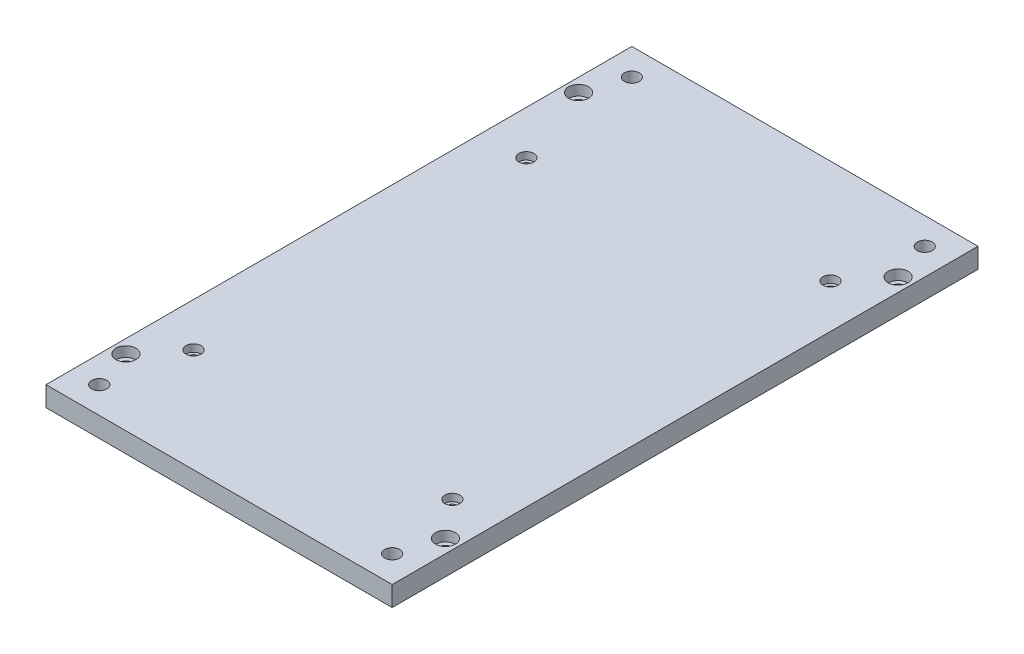
ISO-10303-21;
HEADER;
FILE_DESCRIPTION(('STEP AP214'),'2;1');
FILE_NAME('part.step','',(''),(''),'','','');
FILE_SCHEMA(('AUTOMOTIVE_DESIGN { 1 0 10303 214 1 1 1 1 }'));
ENDSEC;
DATA;
#1=APPLICATION_CONTEXT('core data for automotive mechanical design processes');
#2=APPLICATION_PROTOCOL_DEFINITION('international standard','automotive_design',2000,#1);
#3=PRODUCT_CONTEXT('',#1,'mechanical');
#4=PRODUCT('Part','Part','',(#3));
#5=PRODUCT_RELATED_PRODUCT_CATEGORY('part','',(#4));
#6=PRODUCT_DEFINITION_FORMATION('','',#4);
#7=PRODUCT_DEFINITION_CONTEXT('part definition',#1,'design');
#8=PRODUCT_DEFINITION('design','',#6,#7);
#9=PRODUCT_DEFINITION_SHAPE('','',#8);
#10=(LENGTH_UNIT() NAMED_UNIT(*) SI_UNIT(.MILLI.,.METRE.));
#11=(NAMED_UNIT(*) PLANE_ANGLE_UNIT() SI_UNIT($,.RADIAN.));
#12=(NAMED_UNIT(*) SI_UNIT($,.STERADIAN.) SOLID_ANGLE_UNIT());
#13=UNCERTAINTY_MEASURE_WITH_UNIT(LENGTH_MEASURE(1.E-05),#10,'distance_accuracy_value','');
#14=(GEOMETRIC_REPRESENTATION_CONTEXT(3) GLOBAL_UNCERTAINTY_ASSIGNED_CONTEXT((#13)) GLOBAL_UNIT_ASSIGNED_CONTEXT((#10,
#11,#12)) REPRESENTATION_CONTEXT('',''));
#15=CARTESIAN_POINT('',(0.,0.,0.));
#16=DIRECTION('',(0.,0.,1.));
#17=DIRECTION('',(1.,0.,0.));
#18=AXIS2_PLACEMENT_3D('',#15,#16,#17);
#19=CARTESIAN_POINT('',(0.,9.525,0.));
#20=DIRECTION('',(0.,0.,-1.));
#21=DIRECTION('',(-1.,0.,0.));
#22=AXIS2_PLACEMENT_3D('',#19,#20,#21);
#23=PLANE('',#22);
#24=DIRECTION('',(1.,0.,0.));
#25=VECTOR('',#24,1.);
#26=CARTESIAN_POINT('',(0.,0.,0.));
#27=LINE('',#26,#25);
#28=CARTESIAN_POINT('',(0.,0.,0.));
#29=VERTEX_POINT('',#28);
#30=CARTESIAN_POINT('',(165.1,0.,0.));
#31=VERTEX_POINT('',#30);
#32=EDGE_CURVE('E149',#29,#31,#27,.T.);
#33=ORIENTED_EDGE('',*,*,#32,.T.);
#34=DIRECTION('',(0.,-1.,0.));
#35=VECTOR('',#34,1.);
#36=CARTESIAN_POINT('',(165.1,9.525,0.));
#37=LINE('',#36,#35);
#38=CARTESIAN_POINT('',(165.1,9.525,0.));
#39=VERTEX_POINT('',#38);
#40=EDGE_CURVE('E12',#39,#31,#37,.T.);
#41=ORIENTED_EDGE('',*,*,#40,.F.);
#42=DIRECTION('',(1.,0.,0.));
#43=VECTOR('',#42,1.);
#44=CARTESIAN_POINT('',(0.,9.525,0.));
#45=LINE('',#44,#43);
#46=CARTESIAN_POINT('',(0.,9.525,0.));
#47=VERTEX_POINT('',#46);
#48=EDGE_CURVE('E131',#47,#39,#45,.T.);
#49=ORIENTED_EDGE('',*,*,#48,.F.);
#50=DIRECTION('',(0.,-1.,0.));
#51=VECTOR('',#50,1.);
#52=CARTESIAN_POINT('',(0.,9.525,0.));
#53=LINE('',#52,#51);
#54=EDGE_CURVE('E93',#47,#29,#53,.T.);
#55=ORIENTED_EDGE('',*,*,#54,.T.);
#56=EDGE_LOOP('',(#33,#41,#49,#55));
#57=FACE_BOUND('',#56,.T.);
#58=ADVANCED_FACE('F73',(#57),#23,.F.);
#59=CARTESIAN_POINT('',(165.1,9.525,0.));
#60=DIRECTION('',(-1.,0.,0.));
#61=DIRECTION('',(0.,0.,1.));
#62=AXIS2_PLACEMENT_3D('',#59,#60,#61);
#63=PLANE('',#62);
#64=DIRECTION('',(0.,0.,-1.));
#65=VECTOR('',#64,1.);
#66=CARTESIAN_POINT('',(165.1,0.,0.));
#67=LINE('',#66,#65);
#68=CARTESIAN_POINT('',(165.1,0.,-279.4));
#69=VERTEX_POINT('',#68);
#70=EDGE_CURVE('E137',#31,#69,#67,.T.);
#71=ORIENTED_EDGE('',*,*,#70,.T.);
#72=DIRECTION('',(0.,-1.,0.));
#73=VECTOR('',#72,1.);
#74=CARTESIAN_POINT('',(165.1,9.525,-279.4));
#75=LINE('',#74,#73);
#76=CARTESIAN_POINT('',(165.1,9.525,-279.4));
#77=VERTEX_POINT('',#76);
#78=EDGE_CURVE('E82',#77,#69,#75,.T.);
#79=ORIENTED_EDGE('',*,*,#78,.F.);
#80=DIRECTION('',(0.,0.,-1.));
#81=VECTOR('',#80,1.);
#82=CARTESIAN_POINT('',(165.1,9.525,0.));
#83=LINE('',#82,#81);
#84=EDGE_CURVE('E123',#39,#77,#83,.T.);
#85=ORIENTED_EDGE('',*,*,#84,.F.);
#86=ORIENTED_EDGE('',*,*,#40,.T.);
#87=EDGE_LOOP('',(#71,#79,#85,#86));
#88=FACE_BOUND('',#87,.T.);
#89=ADVANCED_FACE('F136',(#88),#63,.F.);
#90=CARTESIAN_POINT('',(0.,9.525,-279.4));
#91=DIRECTION('',(0.,0.,-1.));
#92=DIRECTION('',(-1.,0.,0.));
#93=AXIS2_PLACEMENT_3D('',#90,#91,#92);
#94=PLANE('',#93);
#95=DIRECTION('',(1.,0.,0.));
#96=VECTOR('',#95,1.);
#97=CARTESIAN_POINT('',(0.,0.,-279.4));
#98=LINE('',#97,#96);
#99=CARTESIAN_POINT('',(0.,0.,-279.4));
#100=VERTEX_POINT('',#99);
#101=EDGE_CURVE('E155',#100,#69,#98,.T.);
#102=ORIENTED_EDGE('',*,*,#101,.F.);
#103=DIRECTION('',(0.,-1.,0.));
#104=VECTOR('',#103,1.);
#105=CARTESIAN_POINT('',(0.,9.525,-279.4));
#106=LINE('',#105,#104);
#107=CARTESIAN_POINT('',(0.,9.525,-279.4));
#108=VERTEX_POINT('',#107);
#109=EDGE_CURVE('E109',#108,#100,#106,.T.);
#110=ORIENTED_EDGE('',*,*,#109,.F.);
#111=DIRECTION('',(1.,0.,0.));
#112=VECTOR('',#111,1.);
#113=CARTESIAN_POINT('',(0.,9.525,-279.4));
#114=LINE('',#113,#112);
#115=EDGE_CURVE('E130',#108,#77,#114,.T.);
#116=ORIENTED_EDGE('',*,*,#115,.T.);
#117=ORIENTED_EDGE('',*,*,#78,.T.);
#118=EDGE_LOOP('',(#102,#110,#116,#117));
#119=FACE_BOUND('',#118,.T.);
#120=ADVANCED_FACE('F141',(#119),#94,.T.);
#121=CARTESIAN_POINT('',(0.,9.525,0.));
#122=DIRECTION('',(-1.,0.,0.));
#123=DIRECTION('',(0.,0.,1.));
#124=AXIS2_PLACEMENT_3D('',#121,#122,#123);
#125=PLANE('',#124);
#126=DIRECTION('',(0.,0.,-1.));
#127=VECTOR('',#126,1.);
#128=CARTESIAN_POINT('',(0.,0.,0.));
#129=LINE('',#128,#127);
#130=EDGE_CURVE('E158',#29,#100,#129,.T.);
#131=ORIENTED_EDGE('',*,*,#130,.F.);
#132=ORIENTED_EDGE('',*,*,#54,.F.);
#133=DIRECTION('',(0.,0.,-1.));
#134=VECTOR('',#133,1.);
#135=CARTESIAN_POINT('',(0.,9.525,0.));
#136=LINE('',#135,#134);
#137=EDGE_CURVE('E143',#47,#108,#136,.T.);
#138=ORIENTED_EDGE('',*,*,#137,.T.);
#139=ORIENTED_EDGE('',*,*,#109,.T.);
#140=EDGE_LOOP('',(#131,#132,#138,#139));
#141=FACE_BOUND('',#140,.T.);
#142=ADVANCED_FACE('F333',(#141),#125,.T.);
#143=CARTESIAN_POINT('',(0.,9.525,0.));
#144=DIRECTION('',(0.,1.,0.));
#145=DIRECTION('',(0.,0.,1.));
#146=AXIS2_PLACEMENT_3D('',#143,#144,#145);
#147=PLANE('',#146);
#148=CARTESIAN_POINT('',(144.272,9.525,-229.87));
#149=DIRECTION('',(0.,1.,0.));
#150=DIRECTION('',(0.,0.,1.));
#151=AXIS2_PLACEMENT_3D('',#148,#149,#150);
#152=CIRCLE('',#151,3.57251);
#153=CARTESIAN_POINT('',(144.272,9.525,-226.29749));
#154=VERTEX_POINT('',#153);
#155=EDGE_CURVE('E323',#154,#154,#152,.T.);
#156=ORIENTED_EDGE('',*,*,#155,.F.);
#157=EDGE_LOOP('',(#156));
#158=FACE_BOUND('',#157,.T.);
#159=CARTESIAN_POINT('',(144.272,9.525,-49.53));
#160=DIRECTION('',(0.,1.,0.));
#161=DIRECTION('',(0.,0.,1.));
#162=AXIS2_PLACEMENT_3D('',#159,#160,#161);
#163=CIRCLE('',#162,3.57251);
#164=CARTESIAN_POINT('',(144.272,9.525,-45.95749));
#165=VERTEX_POINT('',#164);
#166=EDGE_CURVE('E307',#165,#165,#163,.T.);
#167=ORIENTED_EDGE('',*,*,#166,.F.);
#168=EDGE_LOOP('',(#167));
#169=FACE_BOUND('',#168,.T.);
#170=CARTESIAN_POINT('',(20.828,9.525,-49.53));
#171=DIRECTION('',(0.,1.,0.));
#172=DIRECTION('',(0.,0.,1.));
#173=AXIS2_PLACEMENT_3D('',#170,#171,#172);
#174=CIRCLE('',#173,3.57251);
#175=CARTESIAN_POINT('',(20.828,9.525,-45.95749));
#176=VERTEX_POINT('',#175);
#177=EDGE_CURVE('E291',#176,#176,#174,.T.);
#178=ORIENTED_EDGE('',*,*,#177,.F.);
#179=EDGE_LOOP('',(#178));
#180=FACE_BOUND('',#179,.T.);
#181=CARTESIAN_POINT('',(20.828,9.525,-208.28));
#182=DIRECTION('',(0.,1.,0.));
#183=DIRECTION('',(0.,0.,1.));
#184=AXIS2_PLACEMENT_3D('',#181,#182,#183);
#185=CIRCLE('',#184,3.57251);
#186=CARTESIAN_POINT('',(20.828,9.525,-204.70749));
#187=VERTEX_POINT('',#186);
#188=EDGE_CURVE('E275',#187,#187,#185,.T.);
#189=ORIENTED_EDGE('',*,*,#188,.F.);
#190=EDGE_LOOP('',(#189));
#191=FACE_BOUND('',#190,.T.);
#192=CARTESIAN_POINT('',(6.34999999999999,9.525,-31.75));
#193=DIRECTION('',(0.,1.,0.));
#194=DIRECTION('',(0.,0.,1.));
#195=AXIS2_PLACEMENT_3D('',#192,#193,#194);
#196=CIRCLE('',#195,4.7625);
#197=CARTESIAN_POINT('',(6.34999999999999,9.525,-26.9875));
#198=VERTEX_POINT('',#197);
#199=EDGE_CURVE('E259',#198,#198,#196,.T.);
#200=ORIENTED_EDGE('',*,*,#199,.F.);
#201=EDGE_LOOP('',(#200));
#202=FACE_BOUND('',#201,.T.);
#203=CARTESIAN_POINT('',(158.75,9.525,-31.75));
#204=DIRECTION('',(0.,1.,0.));
#205=DIRECTION('',(0.,0.,1.));
#206=AXIS2_PLACEMENT_3D('',#203,#204,#205);
#207=CIRCLE('',#206,4.7625);
#208=CARTESIAN_POINT('',(158.75,9.525,-26.9875));
#209=VERTEX_POINT('',#208);
#210=EDGE_CURVE('E243',#209,#209,#207,.T.);
#211=ORIENTED_EDGE('',*,*,#210,.F.);
#212=EDGE_LOOP('',(#211));
#213=FACE_BOUND('',#212,.T.);
#214=CARTESIAN_POINT('',(158.75,9.525,-247.65));
#215=DIRECTION('',(0.,1.,0.));
#216=DIRECTION('',(0.,0.,1.));
#217=AXIS2_PLACEMENT_3D('',#214,#215,#216);
#218=CIRCLE('',#217,4.7625);
#219=CARTESIAN_POINT('',(158.75,9.525,-242.8875));
#220=VERTEX_POINT('',#219);
#221=EDGE_CURVE('E227',#220,#220,#218,.T.);
#222=ORIENTED_EDGE('',*,*,#221,.F.);
#223=EDGE_LOOP('',(#222));
#224=FACE_BOUND('',#223,.T.);
#225=CARTESIAN_POINT('',(6.34999999999999,9.525,-247.65));
#226=DIRECTION('',(0.,1.,0.));
#227=DIRECTION('',(0.,0.,1.));
#228=AXIS2_PLACEMENT_3D('',#225,#226,#227);
#229=CIRCLE('',#228,4.7625);
#230=CARTESIAN_POINT('',(6.34999999999999,9.525,-242.8875));
#231=VERTEX_POINT('',#230);
#232=EDGE_CURVE('E211',#231,#231,#229,.T.);
#233=ORIENTED_EDGE('',*,*,#232,.F.);
#234=EDGE_LOOP('',(#233));
#235=FACE_BOUND('',#234,.T.);
#236=CARTESIAN_POINT('',(152.4,9.525,-12.7));
#237=DIRECTION('',(0.,1.,0.));
#238=DIRECTION('',(0.,0.,1.));
#239=AXIS2_PLACEMENT_3D('',#236,#237,#238);
#240=CIRCLE('',#239,3.57123999999995);
#241=CARTESIAN_POINT('',(152.4,9.525,-9.12876000000004));
#242=VERTEX_POINT('',#241);
#243=EDGE_CURVE('E195',#242,#242,#240,.T.);
#244=ORIENTED_EDGE('',*,*,#243,.F.);
#245=EDGE_LOOP('',(#244));
#246=FACE_BOUND('',#245,.T.);
#247=CARTESIAN_POINT('',(12.7,9.525,-12.7));
#248=DIRECTION('',(0.,1.,0.));
#249=DIRECTION('',(0.,0.,1.));
#250=AXIS2_PLACEMENT_3D('',#247,#248,#249);
#251=CIRCLE('',#250,3.57123999999996);
#252=CARTESIAN_POINT('',(12.7,9.525,-9.12876000000003));
#253=VERTEX_POINT('',#252);
#254=EDGE_CURVE('E187',#253,#253,#251,.T.);
#255=ORIENTED_EDGE('',*,*,#254,.F.);
#256=EDGE_LOOP('',(#255));
#257=FACE_BOUND('',#256,.T.);
#258=CARTESIAN_POINT('',(12.7,9.525,-266.7));
#259=DIRECTION('',(0.,1.,0.));
#260=DIRECTION('',(0.,0.,1.));
#261=AXIS2_PLACEMENT_3D('',#258,#259,#260);
#262=CIRCLE('',#261,3.57123999999996);
#263=CARTESIAN_POINT('',(12.7,9.525,-263.12876));
#264=VERTEX_POINT('',#263);
#265=EDGE_CURVE('E179',#264,#264,#262,.T.);
#266=ORIENTED_EDGE('',*,*,#265,.F.);
#267=EDGE_LOOP('',(#266));
#268=FACE_BOUND('',#267,.T.);
#269=CARTESIAN_POINT('',(152.4,9.525,-266.7));
#270=DIRECTION('',(0.,1.,0.));
#271=DIRECTION('',(0.,0.,1.));
#272=AXIS2_PLACEMENT_3D('',#269,#270,#271);
#273=CIRCLE('',#272,3.57123999999995);
#274=CARTESIAN_POINT('',(152.4,9.525,-263.12876));
#275=VERTEX_POINT('',#274);
#276=EDGE_CURVE('E171',#275,#275,#273,.T.);
#277=ORIENTED_EDGE('',*,*,#276,.F.);
#278=EDGE_LOOP('',(#277));
#279=FACE_BOUND('',#278,.T.);
#280=ORIENTED_EDGE('',*,*,#48,.T.);
#281=ORIENTED_EDGE('',*,*,#84,.T.);
#282=ORIENTED_EDGE('',*,*,#115,.F.);
#283=ORIENTED_EDGE('',*,*,#137,.F.);
#284=EDGE_LOOP('',(#280,#281,#282,#283));
#285=FACE_BOUND('',#284,.T.);
#286=ADVANCED_FACE('F127',(#158,#169,#180,#191,#202,#213,#224,#235,#246,#257,#268,#279,#285),
#147,.T.);
#287=CARTESIAN_POINT('',(0.,0.,0.));
#288=DIRECTION('',(0.,1.,0.));
#289=DIRECTION('',(0.,0.,1.));
#290=AXIS2_PLACEMENT_3D('',#287,#288,#289);
#291=PLANE('',#290);
#292=CARTESIAN_POINT('',(144.272,0.,-229.87));
#293=DIRECTION('',(0.,1.,0.));
#294=DIRECTION('',(0.,0.,1.));
#295=AXIS2_PLACEMENT_3D('',#292,#293,#294);
#296=CIRCLE('',#295,2.15265000000001);
#297=CARTESIAN_POINT('',(144.272,0.,-227.71735));
#298=VERTEX_POINT('',#297);
#299=EDGE_CURVE('E311',#298,#298,#296,.T.);
#300=ORIENTED_EDGE('',*,*,#299,.T.);
#301=EDGE_LOOP('',(#300));
#302=FACE_BOUND('',#301,.T.);
#303=CARTESIAN_POINT('',(144.272,0.,-49.53));
#304=DIRECTION('',(0.,1.,0.));
#305=DIRECTION('',(0.,0.,1.));
#306=AXIS2_PLACEMENT_3D('',#303,#304,#305);
#307=CIRCLE('',#306,2.15265000000001);
#308=CARTESIAN_POINT('',(144.272,0.,-47.37735));
#309=VERTEX_POINT('',#308);
#310=EDGE_CURVE('E295',#309,#309,#307,.T.);
#311=ORIENTED_EDGE('',*,*,#310,.T.);
#312=EDGE_LOOP('',(#311));
#313=FACE_BOUND('',#312,.T.);
#314=CARTESIAN_POINT('',(20.828,0.,-49.53));
#315=DIRECTION('',(0.,1.,0.));
#316=DIRECTION('',(0.,0.,1.));
#317=AXIS2_PLACEMENT_3D('',#314,#315,#316);
#318=CIRCLE('',#317,2.15265);
#319=CARTESIAN_POINT('',(20.828,0.,-47.37735));
#320=VERTEX_POINT('',#319);
#321=EDGE_CURVE('E279',#320,#320,#318,.T.);
#322=ORIENTED_EDGE('',*,*,#321,.T.);
#323=EDGE_LOOP('',(#322));
#324=FACE_BOUND('',#323,.T.);
#325=CARTESIAN_POINT('',(20.828,0.,-208.28));
#326=DIRECTION('',(0.,1.,0.));
#327=DIRECTION('',(0.,0.,1.));
#328=AXIS2_PLACEMENT_3D('',#325,#326,#327);
#329=CIRCLE('',#328,2.15265);
#330=CARTESIAN_POINT('',(20.828,0.,-206.12735));
#331=VERTEX_POINT('',#330);
#332=EDGE_CURVE('E263',#331,#331,#329,.T.);
#333=ORIENTED_EDGE('',*,*,#332,.T.);
#334=EDGE_LOOP('',(#333));
#335=FACE_BOUND('',#334,.T.);
#336=CARTESIAN_POINT('',(6.34999999999999,0.,-31.75));
#337=DIRECTION('',(0.,1.,0.));
#338=DIRECTION('',(0.,0.,1.));
#339=AXIS2_PLACEMENT_3D('',#336,#337,#338);
#340=CIRCLE('',#339,2.8067);
#341=CARTESIAN_POINT('',(6.34999999999999,0.,-28.9433));
#342=VERTEX_POINT('',#341);
#343=EDGE_CURVE('E247',#342,#342,#340,.T.);
#344=ORIENTED_EDGE('',*,*,#343,.T.);
#345=EDGE_LOOP('',(#344));
#346=FACE_BOUND('',#345,.T.);
#347=CARTESIAN_POINT('',(158.75,0.,-31.75));
#348=DIRECTION('',(0.,1.,0.));
#349=DIRECTION('',(0.,0.,1.));
#350=AXIS2_PLACEMENT_3D('',#347,#348,#349);
#351=CIRCLE('',#350,2.8067);
#352=CARTESIAN_POINT('',(158.75,0.,-28.9433));
#353=VERTEX_POINT('',#352);
#354=EDGE_CURVE('E231',#353,#353,#351,.T.);
#355=ORIENTED_EDGE('',*,*,#354,.T.);
#356=EDGE_LOOP('',(#355));
#357=FACE_BOUND('',#356,.T.);
#358=CARTESIAN_POINT('',(158.75,0.,-247.65));
#359=DIRECTION('',(0.,1.,0.));
#360=DIRECTION('',(0.,0.,1.));
#361=AXIS2_PLACEMENT_3D('',#358,#359,#360);
#362=CIRCLE('',#361,2.8067);
#363=CARTESIAN_POINT('',(158.75,0.,-244.8433));
#364=VERTEX_POINT('',#363);
#365=EDGE_CURVE('E215',#364,#364,#362,.T.);
#366=ORIENTED_EDGE('',*,*,#365,.T.);
#367=EDGE_LOOP('',(#366));
#368=FACE_BOUND('',#367,.T.);
#369=CARTESIAN_POINT('',(6.34999999999999,0.,-247.65));
#370=DIRECTION('',(0.,1.,0.));
#371=DIRECTION('',(0.,0.,1.));
#372=AXIS2_PLACEMENT_3D('',#369,#370,#371);
#373=CIRCLE('',#372,2.8067);
#374=CARTESIAN_POINT('',(6.34999999999999,0.,-244.8433));
#375=VERTEX_POINT('',#374);
#376=EDGE_CURVE('E199',#375,#375,#373,.T.);
#377=ORIENTED_EDGE('',*,*,#376,.T.);
#378=EDGE_LOOP('',(#377));
#379=FACE_BOUND('',#378,.T.);
#380=CARTESIAN_POINT('',(152.4,0.,-12.7));
#381=DIRECTION('',(0.,1.,0.));
#382=DIRECTION('',(0.,0.,1.));
#383=AXIS2_PLACEMENT_3D('',#380,#381,#382);
#384=CIRCLE('',#383,3.57123999999998);
#385=CARTESIAN_POINT('',(152.4,0.,-9.12876000000001));
#386=VERTEX_POINT('',#385);
#387=EDGE_CURVE('E191',#386,#386,#384,.T.);
#388=ORIENTED_EDGE('',*,*,#387,.T.);
#389=EDGE_LOOP('',(#388));
#390=FACE_BOUND('',#389,.T.);
#391=CARTESIAN_POINT('',(12.7,0.,-12.7));
#392=DIRECTION('',(0.,1.,0.));
#393=DIRECTION('',(0.,0.,1.));
#394=AXIS2_PLACEMENT_3D('',#391,#392,#393);
#395=CIRCLE('',#394,3.57123999999998);
#396=CARTESIAN_POINT('',(12.7,0.,-9.12876000000001));
#397=VERTEX_POINT('',#396);
#398=EDGE_CURVE('E183',#397,#397,#395,.T.);
#399=ORIENTED_EDGE('',*,*,#398,.T.);
#400=EDGE_LOOP('',(#399));
#401=FACE_BOUND('',#400,.T.);
#402=CARTESIAN_POINT('',(12.7,0.,-266.7));
#403=DIRECTION('',(0.,1.,0.));
#404=DIRECTION('',(0.,0.,1.));
#405=AXIS2_PLACEMENT_3D('',#402,#403,#404);
#406=CIRCLE('',#405,3.57123999999998);
#407=CARTESIAN_POINT('',(12.7,0.,-263.12876));
#408=VERTEX_POINT('',#407);
#409=EDGE_CURVE('E175',#408,#408,#406,.T.);
#410=ORIENTED_EDGE('',*,*,#409,.T.);
#411=EDGE_LOOP('',(#410));
#412=FACE_BOUND('',#411,.T.);
#413=CARTESIAN_POINT('',(152.4,0.,-266.7));
#414=DIRECTION('',(0.,1.,0.));
#415=DIRECTION('',(0.,0.,1.));
#416=AXIS2_PLACEMENT_3D('',#413,#414,#415);
#417=CIRCLE('',#416,3.57123999999998);
#418=CARTESIAN_POINT('',(152.4,0.,-263.12876));
#419=VERTEX_POINT('',#418);
#420=EDGE_CURVE('E152',#419,#419,#417,.T.);
#421=ORIENTED_EDGE('',*,*,#420,.T.);
#422=EDGE_LOOP('',(#421));
#423=FACE_BOUND('',#422,.T.);
#424=ORIENTED_EDGE('',*,*,#32,.F.);
#425=ORIENTED_EDGE('',*,*,#130,.T.);
#426=ORIENTED_EDGE('',*,*,#101,.T.);
#427=ORIENTED_EDGE('',*,*,#70,.F.);
#428=EDGE_LOOP('',(#424,#425,#426,#427));
#429=FACE_BOUND('',#428,.T.);
#430=ADVANCED_FACE('F332',(#302,#313,#324,#335,#346,#357,#368,#379,#390,#401,#412,#423,#429),
#291,.F.);
#431=CARTESIAN_POINT('',(152.4,9.525,-266.7));
#432=DIRECTION('',(0.,1.,0.));
#433=DIRECTION('',(0.,0.,1.));
#434=AXIS2_PLACEMENT_3D('',#431,#432,#433);
#435=CYLINDRICAL_SURFACE('',#434,3.57123999999998);
#436=ORIENTED_EDGE('',*,*,#420,.F.);
#437=EDGE_LOOP('',(#436));
#438=FACE_BOUND('',#437,.T.);
#439=ORIENTED_EDGE('',*,*,#276,.T.);
#440=EDGE_LOOP('',(#439));
#441=FACE_BOUND('',#440,.T.);
#442=ADVANCED_FACE('F357',(#438,#441),#435,.F.);
#443=CARTESIAN_POINT('',(12.7,9.525,-266.7));
#444=DIRECTION('',(0.,1.,0.));
#445=DIRECTION('',(0.,0.,1.));
#446=AXIS2_PLACEMENT_3D('',#443,#444,#445);
#447=CYLINDRICAL_SURFACE('',#446,3.57123999999998);
#448=ORIENTED_EDGE('',*,*,#409,.F.);
#449=EDGE_LOOP('',(#448));
#450=FACE_BOUND('',#449,.T.);
#451=ORIENTED_EDGE('',*,*,#265,.T.);
#452=EDGE_LOOP('',(#451));
#453=FACE_BOUND('',#452,.T.);
#454=ADVANCED_FACE('F359',(#450,#453),#447,.F.);
#455=CARTESIAN_POINT('',(12.7,9.525,-12.7));
#456=DIRECTION('',(0.,1.,0.));
#457=DIRECTION('',(0.,0.,1.));
#458=AXIS2_PLACEMENT_3D('',#455,#456,#457);
#459=CYLINDRICAL_SURFACE('',#458,3.57123999999998);
#460=ORIENTED_EDGE('',*,*,#398,.F.);
#461=EDGE_LOOP('',(#460));
#462=FACE_BOUND('',#461,.T.);
#463=ORIENTED_EDGE('',*,*,#254,.T.);
#464=EDGE_LOOP('',(#463));
#465=FACE_BOUND('',#464,.T.);
#466=ADVANCED_FACE('F366',(#462,#465),#459,.F.);
#467=CARTESIAN_POINT('',(152.4,9.525,-12.7));
#468=DIRECTION('',(0.,1.,0.));
#469=DIRECTION('',(0.,0.,1.));
#470=AXIS2_PLACEMENT_3D('',#467,#468,#469);
#471=CYLINDRICAL_SURFACE('',#470,3.57123999999998);
#472=ORIENTED_EDGE('',*,*,#387,.F.);
#473=EDGE_LOOP('',(#472));
#474=FACE_BOUND('',#473,.T.);
#475=ORIENTED_EDGE('',*,*,#243,.T.);
#476=EDGE_LOOP('',(#475));
#477=FACE_BOUND('',#476,.T.);
#478=ADVANCED_FACE('F412',(#474,#477),#471,.F.);
#479=CARTESIAN_POINT('',(6.34999999999999,9.525,-247.65));
#480=DIRECTION('',(0.,1.,0.));
#481=DIRECTION('',(0.,0.,1.));
#482=AXIS2_PLACEMENT_3D('',#479,#480,#481);
#483=CYLINDRICAL_SURFACE('',#482,2.8067);
#484=ORIENTED_EDGE('',*,*,#376,.F.);
#485=EDGE_LOOP('',(#484));
#486=FACE_BOUND('',#485,.T.);
#487=CARTESIAN_POINT('',(6.34999999999999,4.699,-247.65));
#488=DIRECTION('',(0.,1.,0.));
#489=DIRECTION('',(0.,0.,1.));
#490=AXIS2_PLACEMENT_3D('',#487,#488,#489);
#491=CIRCLE('',#490,2.8067);
#492=CARTESIAN_POINT('',(6.34999999999999,4.699,-244.8433));
#493=VERTEX_POINT('',#492);
#494=EDGE_CURVE('E203',#493,#493,#491,.T.);
#495=ORIENTED_EDGE('',*,*,#494,.T.);
#496=EDGE_LOOP('',(#495));
#497=FACE_BOUND('',#496,.T.);
#498=ADVANCED_FACE('F422',(#486,#497),#483,.F.);
#499=CARTESIAN_POINT('',(9.15669999999999,4.699,-247.65));
#500=DIRECTION('',(0.,-1.,0.));
#501=DIRECTION('',(0.,0.,-1.));
#502=AXIS2_PLACEMENT_3D('',#499,#500,#501);
#503=PLANE('',#502);
#504=ORIENTED_EDGE('',*,*,#494,.F.);
#505=EDGE_LOOP('',(#504));
#506=FACE_BOUND('',#505,.T.);
#507=CARTESIAN_POINT('',(6.34999999999999,4.699,-247.65));
#508=DIRECTION('',(0.,1.,0.));
#509=DIRECTION('',(0.,0.,1.));
#510=AXIS2_PLACEMENT_3D('',#507,#508,#509);
#511=CIRCLE('',#510,4.7625);
#512=CARTESIAN_POINT('',(6.34999999999999,4.699,-242.8875));
#513=VERTEX_POINT('',#512);
#514=EDGE_CURVE('E207',#513,#513,#511,.T.);
#515=ORIENTED_EDGE('',*,*,#514,.T.);
#516=EDGE_LOOP('',(#515));
#517=FACE_BOUND('',#516,.T.);
#518=ADVANCED_FACE('F431',(#506,#517),#503,.F.);
#519=CARTESIAN_POINT('',(6.34999999999999,9.525,-247.65));
#520=DIRECTION('',(0.,1.,0.));
#521=DIRECTION('',(0.,0.,1.));
#522=AXIS2_PLACEMENT_3D('',#519,#520,#521);
#523=CYLINDRICAL_SURFACE('',#522,4.7625);
#524=ORIENTED_EDGE('',*,*,#514,.F.);
#525=EDGE_LOOP('',(#524));
#526=FACE_BOUND('',#525,.T.);
#527=ORIENTED_EDGE('',*,*,#232,.T.);
#528=EDGE_LOOP('',(#527));
#529=FACE_BOUND('',#528,.T.);
#530=ADVANCED_FACE('F440',(#526,#529),#523,.F.);
#531=CARTESIAN_POINT('',(158.75,9.525,-247.65));
#532=DIRECTION('',(0.,1.,0.));
#533=DIRECTION('',(0.,0.,1.));
#534=AXIS2_PLACEMENT_3D('',#531,#532,#533);
#535=CYLINDRICAL_SURFACE('',#534,2.8067);
#536=ORIENTED_EDGE('',*,*,#365,.F.);
#537=EDGE_LOOP('',(#536));
#538=FACE_BOUND('',#537,.T.);
#539=CARTESIAN_POINT('',(158.75,4.699,-247.65));
#540=DIRECTION('',(0.,1.,0.));
#541=DIRECTION('',(0.,0.,1.));
#542=AXIS2_PLACEMENT_3D('',#539,#540,#541);
#543=CIRCLE('',#542,2.8067);
#544=CARTESIAN_POINT('',(158.75,4.699,-244.8433));
#545=VERTEX_POINT('',#544);
#546=EDGE_CURVE('E219',#545,#545,#543,.T.);
#547=ORIENTED_EDGE('',*,*,#546,.T.);
#548=EDGE_LOOP('',(#547));
#549=FACE_BOUND('',#548,.T.);
#550=ADVANCED_FACE('F449',(#538,#549),#535,.F.);
#551=CARTESIAN_POINT('',(161.5567,4.699,-247.65));
#552=DIRECTION('',(0.,-1.,0.));
#553=DIRECTION('',(0.,0.,-1.));
#554=AXIS2_PLACEMENT_3D('',#551,#552,#553);
#555=PLANE('',#554);
#556=ORIENTED_EDGE('',*,*,#546,.F.);
#557=EDGE_LOOP('',(#556));
#558=FACE_BOUND('',#557,.T.);
#559=CARTESIAN_POINT('',(158.75,4.699,-247.65));
#560=DIRECTION('',(0.,1.,0.));
#561=DIRECTION('',(0.,0.,1.));
#562=AXIS2_PLACEMENT_3D('',#559,#560,#561);
#563=CIRCLE('',#562,4.7625);
#564=CARTESIAN_POINT('',(158.75,4.699,-242.8875));
#565=VERTEX_POINT('',#564);
#566=EDGE_CURVE('E223',#565,#565,#563,.T.);
#567=ORIENTED_EDGE('',*,*,#566,.T.);
#568=EDGE_LOOP('',(#567));
#569=FACE_BOUND('',#568,.T.);
#570=ADVANCED_FACE('F458',(#558,#569),#555,.F.);
#571=CARTESIAN_POINT('',(158.75,9.525,-247.65));
#572=DIRECTION('',(0.,1.,0.));
#573=DIRECTION('',(0.,0.,1.));
#574=AXIS2_PLACEMENT_3D('',#571,#572,#573);
#575=CYLINDRICAL_SURFACE('',#574,4.7625);
#576=ORIENTED_EDGE('',*,*,#566,.F.);
#577=EDGE_LOOP('',(#576));
#578=FACE_BOUND('',#577,.T.);
#579=ORIENTED_EDGE('',*,*,#221,.T.);
#580=EDGE_LOOP('',(#579));
#581=FACE_BOUND('',#580,.T.);
#582=ADVANCED_FACE('F467',(#578,#581),#575,.F.);
#583=CARTESIAN_POINT('',(158.75,9.525,-31.75));
#584=DIRECTION('',(0.,1.,0.));
#585=DIRECTION('',(0.,0.,1.));
#586=AXIS2_PLACEMENT_3D('',#583,#584,#585);
#587=CYLINDRICAL_SURFACE('',#586,2.8067);
#588=ORIENTED_EDGE('',*,*,#354,.F.);
#589=EDGE_LOOP('',(#588));
#590=FACE_BOUND('',#589,.T.);
#591=CARTESIAN_POINT('',(158.75,4.699,-31.75));
#592=DIRECTION('',(0.,1.,0.));
#593=DIRECTION('',(0.,0.,1.));
#594=AXIS2_PLACEMENT_3D('',#591,#592,#593);
#595=CIRCLE('',#594,2.8067);
#596=CARTESIAN_POINT('',(158.75,4.699,-28.9433));
#597=VERTEX_POINT('',#596);
#598=EDGE_CURVE('E235',#597,#597,#595,.T.);
#599=ORIENTED_EDGE('',*,*,#598,.T.);
#600=EDGE_LOOP('',(#599));
#601=FACE_BOUND('',#600,.T.);
#602=ADVANCED_FACE('F476',(#590,#601),#587,.F.);
#603=CARTESIAN_POINT('',(161.5567,4.699,-31.75));
#604=DIRECTION('',(0.,-1.,0.));
#605=DIRECTION('',(0.,0.,-1.));
#606=AXIS2_PLACEMENT_3D('',#603,#604,#605);
#607=PLANE('',#606);
#608=ORIENTED_EDGE('',*,*,#598,.F.);
#609=EDGE_LOOP('',(#608));
#610=FACE_BOUND('',#609,.T.);
#611=CARTESIAN_POINT('',(158.75,4.699,-31.75));
#612=DIRECTION('',(0.,1.,0.));
#613=DIRECTION('',(0.,0.,1.));
#614=AXIS2_PLACEMENT_3D('',#611,#612,#613);
#615=CIRCLE('',#614,4.7625);
#616=CARTESIAN_POINT('',(158.75,4.699,-26.9875));
#617=VERTEX_POINT('',#616);
#618=EDGE_CURVE('E239',#617,#617,#615,.T.);
#619=ORIENTED_EDGE('',*,*,#618,.T.);
#620=EDGE_LOOP('',(#619));
#621=FACE_BOUND('',#620,.T.);
#622=ADVANCED_FACE('F485',(#610,#621),#607,.F.);
#623=CARTESIAN_POINT('',(158.75,9.525,-31.75));
#624=DIRECTION('',(0.,1.,0.));
#625=DIRECTION('',(0.,0.,1.));
#626=AXIS2_PLACEMENT_3D('',#623,#624,#625);
#627=CYLINDRICAL_SURFACE('',#626,4.7625);
#628=ORIENTED_EDGE('',*,*,#618,.F.);
#629=EDGE_LOOP('',(#628));
#630=FACE_BOUND('',#629,.T.);
#631=ORIENTED_EDGE('',*,*,#210,.T.);
#632=EDGE_LOOP('',(#631));
#633=FACE_BOUND('',#632,.T.);
#634=ADVANCED_FACE('F494',(#630,#633),#627,.F.);
#635=CARTESIAN_POINT('',(6.34999999999999,9.525,-31.75));
#636=DIRECTION('',(0.,1.,0.));
#637=DIRECTION('',(0.,0.,1.));
#638=AXIS2_PLACEMENT_3D('',#635,#636,#637);
#639=CYLINDRICAL_SURFACE('',#638,2.8067);
#640=ORIENTED_EDGE('',*,*,#343,.F.);
#641=EDGE_LOOP('',(#640));
#642=FACE_BOUND('',#641,.T.);
#643=CARTESIAN_POINT('',(6.34999999999999,4.699,-31.75));
#644=DIRECTION('',(0.,1.,0.));
#645=DIRECTION('',(0.,0.,1.));
#646=AXIS2_PLACEMENT_3D('',#643,#644,#645);
#647=CIRCLE('',#646,2.8067);
#648=CARTESIAN_POINT('',(6.34999999999999,4.699,-28.9433));
#649=VERTEX_POINT('',#648);
#650=EDGE_CURVE('E251',#649,#649,#647,.T.);
#651=ORIENTED_EDGE('',*,*,#650,.T.);
#652=EDGE_LOOP('',(#651));
#653=FACE_BOUND('',#652,.T.);
#654=ADVANCED_FACE('F503',(#642,#653),#639,.F.);
#655=CARTESIAN_POINT('',(9.15669999999999,4.699,-31.75));
#656=DIRECTION('',(0.,-1.,0.));
#657=DIRECTION('',(0.,0.,-1.));
#658=AXIS2_PLACEMENT_3D('',#655,#656,#657);
#659=PLANE('',#658);
#660=ORIENTED_EDGE('',*,*,#650,.F.);
#661=EDGE_LOOP('',(#660));
#662=FACE_BOUND('',#661,.T.);
#663=CARTESIAN_POINT('',(6.34999999999999,4.699,-31.75));
#664=DIRECTION('',(0.,1.,0.));
#665=DIRECTION('',(0.,0.,1.));
#666=AXIS2_PLACEMENT_3D('',#663,#664,#665);
#667=CIRCLE('',#666,4.7625);
#668=CARTESIAN_POINT('',(6.34999999999999,4.699,-26.9875));
#669=VERTEX_POINT('',#668);
#670=EDGE_CURVE('E255',#669,#669,#667,.T.);
#671=ORIENTED_EDGE('',*,*,#670,.T.);
#672=EDGE_LOOP('',(#671));
#673=FACE_BOUND('',#672,.T.);
#674=ADVANCED_FACE('F512',(#662,#673),#659,.F.);
#675=CARTESIAN_POINT('',(6.34999999999999,9.525,-31.75));
#676=DIRECTION('',(0.,1.,0.));
#677=DIRECTION('',(0.,0.,1.));
#678=AXIS2_PLACEMENT_3D('',#675,#676,#677);
#679=CYLINDRICAL_SURFACE('',#678,4.7625);
#680=ORIENTED_EDGE('',*,*,#670,.F.);
#681=EDGE_LOOP('',(#680));
#682=FACE_BOUND('',#681,.T.);
#683=ORIENTED_EDGE('',*,*,#199,.T.);
#684=EDGE_LOOP('',(#683));
#685=FACE_BOUND('',#684,.T.);
#686=ADVANCED_FACE('F521',(#682,#685),#679,.F.);
#687=CARTESIAN_POINT('',(20.828,9.525,-208.28));
#688=DIRECTION('',(0.,1.,0.));
#689=DIRECTION('',(0.,0.,1.));
#690=AXIS2_PLACEMENT_3D('',#687,#688,#689);
#691=CYLINDRICAL_SURFACE('',#690,2.15265);
#692=ORIENTED_EDGE('',*,*,#332,.F.);
#693=EDGE_LOOP('',(#692));
#694=FACE_BOUND('',#693,.T.);
#695=CARTESIAN_POINT('',(20.828,6.0198,-208.28));
#696=DIRECTION('',(0.,1.,0.));
#697=DIRECTION('',(0.,0.,1.));
#698=AXIS2_PLACEMENT_3D('',#695,#696,#697);
#699=CIRCLE('',#698,2.15265);
#700=CARTESIAN_POINT('',(20.828,6.0198,-206.12735));
#701=VERTEX_POINT('',#700);
#702=EDGE_CURVE('E267',#701,#701,#699,.T.);
#703=ORIENTED_EDGE('',*,*,#702,.T.);
#704=EDGE_LOOP('',(#703));
#705=FACE_BOUND('',#704,.T.);
#706=ADVANCED_FACE('F530',(#694,#705),#691,.F.);
#707=CARTESIAN_POINT('',(22.98065,6.0198,-208.28));
#708=DIRECTION('',(0.,-1.,0.));
#709=DIRECTION('',(0.,0.,-1.));
#710=AXIS2_PLACEMENT_3D('',#707,#708,#709);
#711=PLANE('',#710);
#712=ORIENTED_EDGE('',*,*,#702,.F.);
#713=EDGE_LOOP('',(#712));
#714=FACE_BOUND('',#713,.T.);
#715=CARTESIAN_POINT('',(20.828,6.0198,-208.28));
#716=DIRECTION('',(0.,1.,0.));
#717=DIRECTION('',(0.,0.,1.));
#718=AXIS2_PLACEMENT_3D('',#715,#716,#717);
#719=CIRCLE('',#718,3.57251);
#720=CARTESIAN_POINT('',(20.828,6.0198,-204.70749));
#721=VERTEX_POINT('',#720);
#722=EDGE_CURVE('E271',#721,#721,#719,.T.);
#723=ORIENTED_EDGE('',*,*,#722,.T.);
#724=EDGE_LOOP('',(#723));
#725=FACE_BOUND('',#724,.T.);
#726=ADVANCED_FACE('F549',(#714,#725),#711,.F.);
#727=CARTESIAN_POINT('',(20.828,9.525,-208.28));
#728=DIRECTION('',(0.,1.,0.));
#729=DIRECTION('',(0.,0.,1.));
#730=AXIS2_PLACEMENT_3D('',#727,#728,#729);
#731=CYLINDRICAL_SURFACE('',#730,3.57251);
#732=ORIENTED_EDGE('',*,*,#722,.F.);
#733=EDGE_LOOP('',(#732));
#734=FACE_BOUND('',#733,.T.);
#735=ORIENTED_EDGE('',*,*,#188,.T.);
#736=EDGE_LOOP('',(#735));
#737=FACE_BOUND('',#736,.T.);
#738=ADVANCED_FACE('F558',(#734,#737),#731,.F.);
#739=CARTESIAN_POINT('',(20.828,9.525,-49.53));
#740=DIRECTION('',(0.,1.,0.));
#741=DIRECTION('',(0.,0.,1.));
#742=AXIS2_PLACEMENT_3D('',#739,#740,#741);
#743=CYLINDRICAL_SURFACE('',#742,2.15265);
#744=ORIENTED_EDGE('',*,*,#321,.F.);
#745=EDGE_LOOP('',(#744));
#746=FACE_BOUND('',#745,.T.);
#747=CARTESIAN_POINT('',(20.828,6.0198,-49.53));
#748=DIRECTION('',(0.,1.,0.));
#749=DIRECTION('',(0.,0.,1.));
#750=AXIS2_PLACEMENT_3D('',#747,#748,#749);
#751=CIRCLE('',#750,2.15265);
#752=CARTESIAN_POINT('',(20.828,6.0198,-47.37735));
#753=VERTEX_POINT('',#752);
#754=EDGE_CURVE('E283',#753,#753,#751,.T.);
#755=ORIENTED_EDGE('',*,*,#754,.T.);
#756=EDGE_LOOP('',(#755));
#757=FACE_BOUND('',#756,.T.);
#758=ADVANCED_FACE('F567',(#746,#757),#743,.F.);
#759=CARTESIAN_POINT('',(22.98065,6.0198,-49.53));
#760=DIRECTION('',(0.,-1.,0.));
#761=DIRECTION('',(0.,0.,-1.));
#762=AXIS2_PLACEMENT_3D('',#759,#760,#761);
#763=PLANE('',#762);
#764=ORIENTED_EDGE('',*,*,#754,.F.);
#765=EDGE_LOOP('',(#764));
#766=FACE_BOUND('',#765,.T.);
#767=CARTESIAN_POINT('',(20.828,6.0198,-49.53));
#768=DIRECTION('',(0.,1.,0.));
#769=DIRECTION('',(0.,0.,1.));
#770=AXIS2_PLACEMENT_3D('',#767,#768,#769);
#771=CIRCLE('',#770,3.57251);
#772=CARTESIAN_POINT('',(20.828,6.0198,-45.95749));
#773=VERTEX_POINT('',#772);
#774=EDGE_CURVE('E287',#773,#773,#771,.T.);
#775=ORIENTED_EDGE('',*,*,#774,.T.);
#776=EDGE_LOOP('',(#775));
#777=FACE_BOUND('',#776,.T.);
#778=ADVANCED_FACE('F576',(#766,#777),#763,.F.);
#779=CARTESIAN_POINT('',(20.828,9.525,-49.53));
#780=DIRECTION('',(0.,1.,0.));
#781=DIRECTION('',(0.,0.,1.));
#782=AXIS2_PLACEMENT_3D('',#779,#780,#781);
#783=CYLINDRICAL_SURFACE('',#782,3.57251);
#784=ORIENTED_EDGE('',*,*,#774,.F.);
#785=EDGE_LOOP('',(#784));
#786=FACE_BOUND('',#785,.T.);
#787=ORIENTED_EDGE('',*,*,#177,.T.);
#788=EDGE_LOOP('',(#787));
#789=FACE_BOUND('',#788,.T.);
#790=ADVANCED_FACE('F585',(#786,#789),#783,.F.);
#791=CARTESIAN_POINT('',(144.272,9.525,-49.53));
#792=DIRECTION('',(0.,1.,0.));
#793=DIRECTION('',(0.,0.,1.));
#794=AXIS2_PLACEMENT_3D('',#791,#792,#793);
#795=CYLINDRICAL_SURFACE('',#794,2.15265000000001);
#796=ORIENTED_EDGE('',*,*,#310,.F.);
#797=EDGE_LOOP('',(#796));
#798=FACE_BOUND('',#797,.T.);
#799=CARTESIAN_POINT('',(144.272,6.0198,-49.53));
#800=DIRECTION('',(0.,1.,0.));
#801=DIRECTION('',(0.,0.,1.));
#802=AXIS2_PLACEMENT_3D('',#799,#800,#801);
#803=CIRCLE('',#802,2.15265000000001);
#804=CARTESIAN_POINT('',(144.272,6.0198,-47.37735));
#805=VERTEX_POINT('',#804);
#806=EDGE_CURVE('E299',#805,#805,#803,.T.);
#807=ORIENTED_EDGE('',*,*,#806,.T.);
#808=EDGE_LOOP('',(#807));
#809=FACE_BOUND('',#808,.T.);
#810=ADVANCED_FACE('F594',(#798,#809),#795,.F.);
#811=CARTESIAN_POINT('',(146.42465,6.0198,-49.53));
#812=DIRECTION('',(0.,-1.,0.));
#813=DIRECTION('',(0.,0.,-1.));
#814=AXIS2_PLACEMENT_3D('',#811,#812,#813);
#815=PLANE('',#814);
#816=ORIENTED_EDGE('',*,*,#806,.F.);
#817=EDGE_LOOP('',(#816));
#818=FACE_BOUND('',#817,.T.);
#819=CARTESIAN_POINT('',(144.272,6.0198,-49.53));
#820=DIRECTION('',(0.,1.,0.));
#821=DIRECTION('',(0.,0.,1.));
#822=AXIS2_PLACEMENT_3D('',#819,#820,#821);
#823=CIRCLE('',#822,3.57251);
#824=CARTESIAN_POINT('',(144.272,6.0198,-45.95749));
#825=VERTEX_POINT('',#824);
#826=EDGE_CURVE('E303',#825,#825,#823,.T.);
#827=ORIENTED_EDGE('',*,*,#826,.T.);
#828=EDGE_LOOP('',(#827));
#829=FACE_BOUND('',#828,.T.);
#830=ADVANCED_FACE('F603',(#818,#829),#815,.F.);
#831=CARTESIAN_POINT('',(144.272,9.525,-49.53));
#832=DIRECTION('',(0.,1.,0.));
#833=DIRECTION('',(0.,0.,1.));
#834=AXIS2_PLACEMENT_3D('',#831,#832,#833);
#835=CYLINDRICAL_SURFACE('',#834,3.57251);
#836=ORIENTED_EDGE('',*,*,#826,.F.);
#837=EDGE_LOOP('',(#836));
#838=FACE_BOUND('',#837,.T.);
#839=ORIENTED_EDGE('',*,*,#166,.T.);
#840=EDGE_LOOP('',(#839));
#841=FACE_BOUND('',#840,.T.);
#842=ADVANCED_FACE('F612',(#838,#841),#835,.F.);
#843=CARTESIAN_POINT('',(144.272,9.525,-229.87));
#844=DIRECTION('',(0.,1.,0.));
#845=DIRECTION('',(0.,0.,1.));
#846=AXIS2_PLACEMENT_3D('',#843,#844,#845);
#847=CYLINDRICAL_SURFACE('',#846,2.15265000000001);
#848=ORIENTED_EDGE('',*,*,#299,.F.);
#849=EDGE_LOOP('',(#848));
#850=FACE_BOUND('',#849,.T.);
#851=CARTESIAN_POINT('',(144.272,6.0198,-229.87));
#852=DIRECTION('',(0.,1.,0.));
#853=DIRECTION('',(0.,0.,1.));
#854=AXIS2_PLACEMENT_3D('',#851,#852,#853);
#855=CIRCLE('',#854,2.15265000000001);
#856=CARTESIAN_POINT('',(144.272,6.0198,-227.71735));
#857=VERTEX_POINT('',#856);
#858=EDGE_CURVE('E315',#857,#857,#855,.T.);
#859=ORIENTED_EDGE('',*,*,#858,.T.);
#860=EDGE_LOOP('',(#859));
#861=FACE_BOUND('',#860,.T.);
#862=ADVANCED_FACE('F621',(#850,#861),#847,.F.);
#863=CARTESIAN_POINT('',(146.42465,6.0198,-229.87));
#864=DIRECTION('',(0.,-1.,0.));
#865=DIRECTION('',(0.,0.,-1.));
#866=AXIS2_PLACEMENT_3D('',#863,#864,#865);
#867=PLANE('',#866);
#868=ORIENTED_EDGE('',*,*,#858,.F.);
#869=EDGE_LOOP('',(#868));
#870=FACE_BOUND('',#869,.T.);
#871=CARTESIAN_POINT('',(144.272,6.0198,-229.87));
#872=DIRECTION('',(0.,1.,0.));
#873=DIRECTION('',(0.,0.,1.));
#874=AXIS2_PLACEMENT_3D('',#871,#872,#873);
#875=CIRCLE('',#874,3.57251);
#876=CARTESIAN_POINT('',(144.272,6.0198,-226.29749));
#877=VERTEX_POINT('',#876);
#878=EDGE_CURVE('E319',#877,#877,#875,.T.);
#879=ORIENTED_EDGE('',*,*,#878,.T.);
#880=EDGE_LOOP('',(#879));
#881=FACE_BOUND('',#880,.T.);
#882=ADVANCED_FACE('F630',(#870,#881),#867,.F.);
#883=CARTESIAN_POINT('',(144.272,9.525,-229.87));
#884=DIRECTION('',(0.,1.,0.));
#885=DIRECTION('',(0.,0.,1.));
#886=AXIS2_PLACEMENT_3D('',#883,#884,#885);
#887=CYLINDRICAL_SURFACE('',#886,3.57251);
#888=ORIENTED_EDGE('',*,*,#878,.F.);
#889=EDGE_LOOP('',(#888));
#890=FACE_BOUND('',#889,.T.);
#891=ORIENTED_EDGE('',*,*,#155,.T.);
#892=EDGE_LOOP('',(#891));
#893=FACE_BOUND('',#892,.T.);
#894=ADVANCED_FACE('F328',(#890,#893),#887,.F.);
#895=CLOSED_SHELL('',(#58,#89,#120,#142,#286,#430,#442,#454,#466,#478,#498,#518,#530,#550,#570,
#582,#602,#622,#634,#654,#674,#686,#706,#726,#738,#758,#778,#790,#810,#830,#842,#862,#882,#894));
#896=MANIFOLD_SOLID_BREP('B2',#895);
#897=ADVANCED_BREP_SHAPE_REPRESENTATION('',(#18,#896),#14);
#898=SHAPE_DEFINITION_REPRESENTATION(#9,#897);
ENDSEC;
END-ISO-10303-21;
